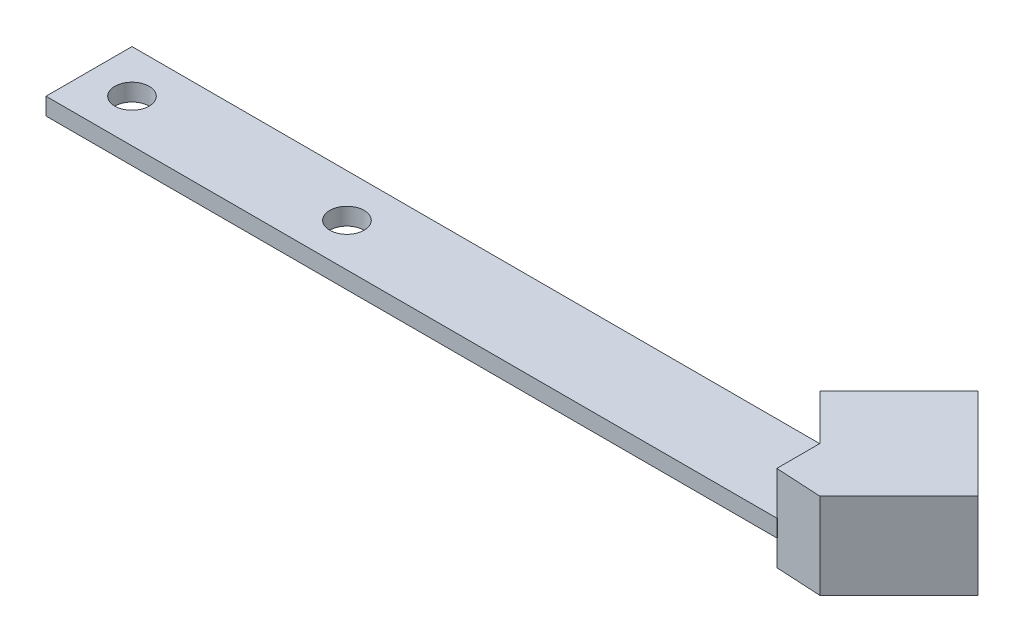
ISO-10303-21;
HEADER;
FILE_DESCRIPTION(('STEP AP214'),'2;1');
FILE_NAME('part.step','',(''),(''),'','','');
FILE_SCHEMA(('AUTOMOTIVE_DESIGN { 1 0 10303 214 1 1 1 1 }'));
ENDSEC;
DATA;
#1=APPLICATION_CONTEXT('core data for automotive mechanical design processes');
#2=APPLICATION_PROTOCOL_DEFINITION('international standard','automotive_design',2000,#1);
#3=PRODUCT_CONTEXT('',#1,'mechanical');
#4=PRODUCT('Part','Part','',(#3));
#5=PRODUCT_RELATED_PRODUCT_CATEGORY('part','',(#4));
#6=PRODUCT_DEFINITION_FORMATION('','',#4);
#7=PRODUCT_DEFINITION_CONTEXT('part definition',#1,'design');
#8=PRODUCT_DEFINITION('design','',#6,#7);
#9=PRODUCT_DEFINITION_SHAPE('','',#8);
#10=(LENGTH_UNIT() NAMED_UNIT(*) SI_UNIT(.MILLI.,.METRE.));
#11=(NAMED_UNIT(*) PLANE_ANGLE_UNIT() SI_UNIT($,.RADIAN.));
#12=(NAMED_UNIT(*) SI_UNIT($,.STERADIAN.) SOLID_ANGLE_UNIT());
#13=UNCERTAINTY_MEASURE_WITH_UNIT(LENGTH_MEASURE(1.E-05),#10,'distance_accuracy_value','');
#14=(GEOMETRIC_REPRESENTATION_CONTEXT(3) GLOBAL_UNCERTAINTY_ASSIGNED_CONTEXT((#13)) GLOBAL_UNIT_ASSIGNED_CONTEXT((#10,
#11,#12)) REPRESENTATION_CONTEXT('',''));
#15=CARTESIAN_POINT('',(0.,0.,0.));
#16=DIRECTION('',(0.,0.,1.));
#17=DIRECTION('',(1.,0.,0.));
#18=AXIS2_PLACEMENT_3D('',#15,#16,#17);
#19=CARTESIAN_POINT('',(0.,2.,0.));
#20=DIRECTION('',(0.,1.,0.));
#21=DIRECTION('',(0.,0.,1.));
#22=AXIS2_PLACEMENT_3D('',#19,#20,#21);
#23=PLANE('',#22);
#24=DIRECTION('',(0.998523413977836,0.,0.054323031377558));
#25=VECTOR('',#24,1.);
#26=CARTESIAN_POINT('',(0.0223121681594435,2.,-0.410124798982022));
#27=LINE('',#26,#25);
#28=CARTESIAN_POINT('',(60.7009699996036,2.,2.89099822646044));
#29=VERTEX_POINT('',#28);
#30=CARTESIAN_POINT('',(60.7708185534303,2.,2.89479822266292));
#31=VERTEX_POINT('',#30);
#32=EDGE_CURVE('E168',#29,#31,#27,.T.);
#33=ORIENTED_EDGE('',*,*,#32,.F.);
#34=DIRECTION('',(0.,0.,1.));
#35=VECTOR('',#34,1.);
#36=CARTESIAN_POINT('',(60.7009699996036,2.,0.));
#37=LINE('',#36,#35);
#38=CARTESIAN_POINT('',(60.7009699996036,2.,-2.12378523271647));
#39=VERTEX_POINT('',#38);
#40=EDGE_CURVE('E162',#39,#29,#37,.T.);
#41=ORIENTED_EDGE('',*,*,#40,.F.);
#42=DIRECTION('',(-0.707106781186549,0.,-0.707106781186546));
#43=VECTOR('',#42,1.);
#44=CARTESIAN_POINT('',(31.4123776161599,2.,-31.4123776161601));
#45=LINE('',#44,#43);
#46=CARTESIAN_POINT('',(55.7708185534303,2.,-7.05393667888983));
#47=VERTEX_POINT('',#46);
#48=EDGE_CURVE('E199',#39,#47,#45,.T.);
#49=ORIENTED_EDGE('',*,*,#48,.T.);
#50=DIRECTION('',(-1.,0.,0.));
#51=VECTOR('',#50,1.);
#52=CARTESIAN_POINT('',(-24.2291814465697,2.,-7.05393667888983));
#53=LINE('',#52,#51);
#54=CARTESIAN_POINT('',(-24.2291814465697,2.,-7.05393667888983));
#55=VERTEX_POINT('',#54);
#56=EDGE_CURVE('E224',#47,#55,#53,.T.);
#57=ORIENTED_EDGE('',*,*,#56,.T.);
#58=DIRECTION('',(0.,0.,1.));
#59=VECTOR('',#58,1.);
#60=CARTESIAN_POINT('',(-24.2291814465697,2.,-7.05393667888983));
#61=LINE('',#60,#59);
#62=CARTESIAN_POINT('',(-24.2291814465697,2.,2.94606332111017));
#63=VERTEX_POINT('',#62);
#64=EDGE_CURVE('E215',#55,#63,#61,.T.);
#65=ORIENTED_EDGE('',*,*,#64,.T.);
#66=DIRECTION('',(1.,0.,0.));
#67=VECTOR('',#66,1.);
#68=CARTESIAN_POINT('',(-24.2291814465697,2.,2.94606332111017));
#69=LINE('',#68,#67);
#70=CARTESIAN_POINT('',(60.7708185534303,2.,2.94606332111017));
#71=VERTEX_POINT('',#70);
#72=EDGE_CURVE('E218',#63,#71,#69,.T.);
#73=ORIENTED_EDGE('',*,*,#72,.T.);
#74=DIRECTION('',(0.,0.,-1.));
#75=VECTOR('',#74,1.);
#76=CARTESIAN_POINT('',(60.7708185534303,2.,-7.05393667888983));
#77=LINE('',#76,#75);
#78=EDGE_CURVE('E221',#71,#31,#77,.T.);
#79=ORIENTED_EDGE('',*,*,#78,.T.);
#80=EDGE_LOOP('',(#33,#41,#49,#57,#65,#73,#79));
#81=FACE_BOUND('',#80,.T.);
#82=CARTESIAN_POINT('',(-19.2291814465697,2.,-2.05393667888983));
#83=DIRECTION('',(0.,1.,0.));
#84=DIRECTION('',(0.,0.,1.));
#85=AXIS2_PLACEMENT_3D('',#82,#83,#84);
#86=CIRCLE('',#85,2.);
#87=CARTESIAN_POINT('',(-19.2291814465697,2.,-0.0539366788898303));
#88=VERTEX_POINT('',#87);
#89=EDGE_CURVE('E209',#88,#88,#86,.T.);
#90=ORIENTED_EDGE('',*,*,#89,.F.);
#91=EDGE_LOOP('',(#90));
#92=FACE_BOUND('',#91,.T.);
#93=CARTESIAN_POINT('',(5.77081855343026,2.,-2.05393667888983));
#94=DIRECTION('',(0.,1.,0.));
#95=DIRECTION('',(0.,0.,1.));
#96=AXIS2_PLACEMENT_3D('',#93,#94,#95);
#97=CIRCLE('',#96,2.);
#98=CARTESIAN_POINT('',(5.77081855343026,2.,-0.0539366788898329));
#99=VERTEX_POINT('',#98);
#100=EDGE_CURVE('E203',#99,#99,#97,.T.);
#101=ORIENTED_EDGE('',*,*,#100,.F.);
#102=EDGE_LOOP('',(#101));
#103=FACE_BOUND('',#102,.T.);
#104=ADVANCED_FACE('F33',(#81,#92,#103),#23,.T.);
#105=CARTESIAN_POINT('',(0.,0.,0.));
#106=DIRECTION('',(0.,1.,0.));
#107=DIRECTION('',(0.,0.,1.));
#108=AXIS2_PLACEMENT_3D('',#105,#106,#107);
#109=PLANE('',#108);
#110=CARTESIAN_POINT('',(5.77081855343026,0.,-2.05393667888983));
#111=DIRECTION('',(0.,1.,0.));
#112=DIRECTION('',(0.,0.,1.));
#113=AXIS2_PLACEMENT_3D('',#110,#111,#112);
#114=CIRCLE('',#113,2.);
#115=CARTESIAN_POINT('',(5.77081855343026,0.,-0.0539366788898329));
#116=VERTEX_POINT('',#115);
#117=EDGE_CURVE('E202',#116,#116,#114,.T.);
#118=ORIENTED_EDGE('',*,*,#117,.T.);
#119=EDGE_LOOP('',(#118));
#120=FACE_BOUND('',#119,.T.);
#121=CARTESIAN_POINT('',(-19.2291814465697,0.,-2.05393667888983));
#122=DIRECTION('',(0.,1.,0.));
#123=DIRECTION('',(0.,0.,1.));
#124=AXIS2_PLACEMENT_3D('',#121,#122,#123);
#125=CIRCLE('',#124,2.);
#126=CARTESIAN_POINT('',(-19.2291814465697,0.,-0.0539366788898303));
#127=VERTEX_POINT('',#126);
#128=EDGE_CURVE('E206',#127,#127,#125,.T.);
#129=ORIENTED_EDGE('',*,*,#128,.T.);
#130=EDGE_LOOP('',(#129));
#131=FACE_BOUND('',#130,.T.);
#132=DIRECTION('',(0.,0.,1.));
#133=VECTOR('',#132,1.);
#134=CARTESIAN_POINT('',(60.7009699996036,0.,0.));
#135=LINE('',#134,#133);
#136=CARTESIAN_POINT('',(60.7009699996036,0.,-2.12378523271647));
#137=VERTEX_POINT('',#136);
#138=CARTESIAN_POINT('',(60.7009699996036,0.,2.89099822646044));
#139=VERTEX_POINT('',#138);
#140=EDGE_CURVE('E138',#137,#139,#135,.T.);
#141=ORIENTED_EDGE('',*,*,#140,.T.);
#142=DIRECTION('',(0.998523413977836,0.,0.054323031377558));
#143=VECTOR('',#142,1.);
#144=CARTESIAN_POINT('',(0.0223121681594435,0.,-0.410124798982022));
#145=LINE('',#144,#143);
#146=CARTESIAN_POINT('',(60.7708185534303,0.,2.89479822266292));
#147=VERTEX_POINT('',#146);
#148=EDGE_CURVE('E135',#139,#147,#145,.T.);
#149=ORIENTED_EDGE('',*,*,#148,.T.);
#150=DIRECTION('',(0.,0.,-1.));
#151=VECTOR('',#150,1.);
#152=CARTESIAN_POINT('',(60.7708185534303,0.,-7.05393667888983));
#153=LINE('',#152,#151);
#154=CARTESIAN_POINT('',(60.7708185534303,0.,2.94606332111017));
#155=VERTEX_POINT('',#154);
#156=EDGE_CURVE('E231',#155,#147,#153,.T.);
#157=ORIENTED_EDGE('',*,*,#156,.F.);
#158=DIRECTION('',(1.,0.,0.));
#159=VECTOR('',#158,1.);
#160=CARTESIAN_POINT('',(-24.2291814465697,0.,2.94606332111017));
#161=LINE('',#160,#159);
#162=CARTESIAN_POINT('',(-24.2291814465697,0.,2.94606332111017));
#163=VERTEX_POINT('',#162);
#164=EDGE_CURVE('E229',#163,#155,#161,.T.);
#165=ORIENTED_EDGE('',*,*,#164,.F.);
#166=DIRECTION('',(0.,0.,1.));
#167=VECTOR('',#166,1.);
#168=CARTESIAN_POINT('',(-24.2291814465697,0.,-7.05393667888983));
#169=LINE('',#168,#167);
#170=CARTESIAN_POINT('',(-24.2291814465697,0.,-7.05393667888983));
#171=VERTEX_POINT('',#170);
#172=EDGE_CURVE('E212',#171,#163,#169,.T.);
#173=ORIENTED_EDGE('',*,*,#172,.F.);
#174=DIRECTION('',(-1.,0.,0.));
#175=VECTOR('',#174,1.);
#176=CARTESIAN_POINT('',(-24.2291814465697,0.,-7.05393667888983));
#177=LINE('',#176,#175);
#178=CARTESIAN_POINT('',(55.7708185534302,0.,-7.05393667888983));
#179=VERTEX_POINT('',#178);
#180=EDGE_CURVE('E219',#179,#171,#177,.T.);
#181=ORIENTED_EDGE('',*,*,#180,.F.);
#182=DIRECTION('',(-0.707106781186549,0.,-0.707106781186546));
#183=VECTOR('',#182,1.);
#184=CARTESIAN_POINT('',(31.4123776161599,0.,-31.4123776161601));
#185=LINE('',#184,#183);
#186=EDGE_CURVE('E55',#137,#179,#185,.T.);
#187=ORIENTED_EDGE('',*,*,#186,.F.);
#188=EDGE_LOOP('',(#141,#149,#157,#165,#173,#181,#187));
#189=FACE_BOUND('',#188,.T.);
#190=ADVANCED_FACE('F250',(#120,#131,#189),#109,.F.);
#191=CARTESIAN_POINT('',(60.7708185534303,2.,-7.05393667888983));
#192=DIRECTION('',(-1.,0.,0.));
#193=DIRECTION('',(0.,0.,1.));
#194=AXIS2_PLACEMENT_3D('',#191,#192,#193);
#195=PLANE('',#194);
#196=ORIENTED_EDGE('',*,*,#156,.T.);
#197=DIRECTION('',(0.,1.,0.));
#198=VECTOR('',#197,1.);
#199=CARTESIAN_POINT('',(60.7708185534303,2.,2.89479822266292));
#200=LINE('',#199,#198);
#201=EDGE_CURVE('E164',#147,#31,#200,.T.);
#202=ORIENTED_EDGE('',*,*,#201,.T.);
#203=ORIENTED_EDGE('',*,*,#78,.F.);
#204=DIRECTION('',(0.,-1.,0.));
#205=VECTOR('',#204,1.);
#206=CARTESIAN_POINT('',(60.7708185534303,2.,2.94606332111017));
#207=LINE('',#206,#205);
#208=EDGE_CURVE('E237',#71,#155,#207,.T.);
#209=ORIENTED_EDGE('',*,*,#208,.T.);
#210=EDGE_LOOP('',(#196,#202,#203,#209));
#211=FACE_BOUND('',#210,.T.);
#212=ADVANCED_FACE('F253',(#211),#195,.F.);
#213=CARTESIAN_POINT('',(-24.2291814465697,2.,-7.05393667888983));
#214=DIRECTION('',(0.,0.,1.));
#215=DIRECTION('',(1.,0.,0.));
#216=AXIS2_PLACEMENT_3D('',#213,#214,#215);
#217=PLANE('',#216);
#218=DIRECTION('',(0.,1.,0.));
#219=VECTOR('',#218,1.);
#220=CARTESIAN_POINT('',(55.7708185534302,2.,-7.05393667888983));
#221=LINE('',#220,#219);
#222=EDGE_CURVE('E11',#179,#47,#221,.T.);
#223=ORIENTED_EDGE('',*,*,#222,.F.);
#224=ORIENTED_EDGE('',*,*,#180,.T.);
#225=DIRECTION('',(0.,-1.,0.));
#226=VECTOR('',#225,1.);
#227=CARTESIAN_POINT('',(-24.2291814465697,2.,-7.05393667888983));
#228=LINE('',#227,#226);
#229=EDGE_CURVE('E226',#55,#171,#228,.T.);
#230=ORIENTED_EDGE('',*,*,#229,.F.);
#231=ORIENTED_EDGE('',*,*,#56,.F.);
#232=EDGE_LOOP('',(#223,#224,#230,#231));
#233=FACE_BOUND('',#232,.T.);
#234=ADVANCED_FACE('F262',(#233),#217,.F.);
#235=CARTESIAN_POINT('',(-24.2291814465697,2.,-7.05393667888983));
#236=DIRECTION('',(1.,0.,0.));
#237=DIRECTION('',(0.,0.,-1.));
#238=AXIS2_PLACEMENT_3D('',#235,#236,#237);
#239=PLANE('',#238);
#240=ORIENTED_EDGE('',*,*,#172,.T.);
#241=DIRECTION('',(0.,-1.,0.));
#242=VECTOR('',#241,1.);
#243=CARTESIAN_POINT('',(-24.2291814465697,2.,2.94606332111017));
#244=LINE('',#243,#242);
#245=EDGE_CURVE('E41',#63,#163,#244,.T.);
#246=ORIENTED_EDGE('',*,*,#245,.F.);
#247=ORIENTED_EDGE('',*,*,#64,.F.);
#248=ORIENTED_EDGE('',*,*,#229,.T.);
#249=EDGE_LOOP('',(#240,#246,#247,#248));
#250=FACE_BOUND('',#249,.T.);
#251=ADVANCED_FACE('F35',(#250),#239,.F.);
#252=CARTESIAN_POINT('',(-24.2291814465697,2.,2.94606332111017));
#253=DIRECTION('',(0.,0.,-1.));
#254=DIRECTION('',(-1.,0.,0.));
#255=AXIS2_PLACEMENT_3D('',#252,#253,#254);
#256=PLANE('',#255);
#257=ORIENTED_EDGE('',*,*,#164,.T.);
#258=ORIENTED_EDGE('',*,*,#208,.F.);
#259=ORIENTED_EDGE('',*,*,#72,.F.);
#260=ORIENTED_EDGE('',*,*,#245,.T.);
#261=EDGE_LOOP('',(#257,#258,#259,#260));
#262=FACE_BOUND('',#261,.T.);
#263=ADVANCED_FACE('F242',(#262),#256,.F.);
#264=CARTESIAN_POINT('',(-19.2291814465697,2.,-2.05393667888983));
#265=DIRECTION('',(0.,-1.,0.));
#266=DIRECTION('',(0.,0.,-1.));
#267=AXIS2_PLACEMENT_3D('',#264,#265,#266);
#268=CYLINDRICAL_SURFACE('',#267,2.);
#269=ORIENTED_EDGE('',*,*,#89,.T.);
#270=EDGE_LOOP('',(#269));
#271=FACE_BOUND('',#270,.T.);
#272=ORIENTED_EDGE('',*,*,#128,.F.);
#273=EDGE_LOOP('',(#272));
#274=FACE_BOUND('',#273,.T.);
#275=ADVANCED_FACE('F297',(#271,#274),#268,.F.);
#276=CARTESIAN_POINT('',(5.77081855343026,2.,-2.05393667888983));
#277=DIRECTION('',(0.,-1.,0.));
#278=DIRECTION('',(0.,0.,-1.));
#279=AXIS2_PLACEMENT_3D('',#276,#277,#278);
#280=CYLINDRICAL_SURFACE('',#279,2.);
#281=ORIENTED_EDGE('',*,*,#100,.T.);
#282=EDGE_LOOP('',(#281));
#283=FACE_BOUND('',#282,.T.);
#284=ORIENTED_EDGE('',*,*,#117,.F.);
#285=EDGE_LOOP('',(#284));
#286=FACE_BOUND('',#285,.T.);
#287=ADVANCED_FACE('F308',(#283,#286),#280,.F.);
#288=CARTESIAN_POINT('',(31.41237761616,0.,-31.4123776161601));
#289=DIRECTION('',(-0.707106781186546,0.,0.707106781186549));
#290=DIRECTION('',(0.707106781186549,0.,0.707106781186546));
#291=AXIS2_PLACEMENT_3D('',#288,#289,#290);
#292=PLANE('',#291);
#293=DIRECTION('',(0.,1.,0.));
#294=VECTOR('',#293,1.);
#295=CARTESIAN_POINT('',(60.7009699996036,-3.04738705511553,-2.12378523271647));
#296=LINE('',#295,#294);
#297=CARTESIAN_POINT('',(60.7009699996036,6.95261294488447,-2.12378523271647));
#298=VERTEX_POINT('',#297);
#299=EDGE_CURVE('E151',#39,#298,#296,.T.);
#300=ORIENTED_EDGE('',*,*,#299,.T.);
#301=DIRECTION('',(0.707106781186549,0.,0.707106781186546));
#302=VECTOR('',#301,1.);
#303=CARTESIAN_POINT('',(55.3976691407045,6.95261294488447,-7.42708609161557));
#304=LINE('',#303,#302);
#305=CARTESIAN_POINT('',(55.3976691407045,6.95261294488447,-7.42708609161557));
#306=VERTEX_POINT('',#305);
#307=EDGE_CURVE('E184',#306,#298,#304,.T.);
#308=ORIENTED_EDGE('',*,*,#307,.F.);
#309=DIRECTION('',(0.,1.,0.));
#310=VECTOR('',#309,1.);
#311=CARTESIAN_POINT('',(55.3976691407045,6.95261294488447,-7.42708609161557));
#312=LINE('',#311,#310);
#313=CARTESIAN_POINT('',(55.3976691407045,-3.04738705511553,-7.42708609161557));
#314=VERTEX_POINT('',#313);
#315=EDGE_CURVE('E170',#314,#306,#312,.T.);
#316=ORIENTED_EDGE('',*,*,#315,.F.);
#317=DIRECTION('',(-0.707106781186549,0.,-0.707106781186546));
#318=VECTOR('',#317,1.);
#319=CARTESIAN_POINT('',(55.3976691407045,-3.04738705511553,-7.42708609161557));
#320=LINE('',#319,#318);
#321=CARTESIAN_POINT('',(60.7009699996036,-3.04738705511553,-2.12378523271647));
#322=VERTEX_POINT('',#321);
#323=EDGE_CURVE('E175',#322,#314,#320,.T.);
#324=ORIENTED_EDGE('',*,*,#323,.F.);
#325=EDGE_CURVE('E142',#322,#137,#296,.T.);
#326=ORIENTED_EDGE('',*,*,#325,.T.);
#327=ORIENTED_EDGE('',*,*,#186,.T.);
#328=ORIENTED_EDGE('',*,*,#222,.T.);
#329=ORIENTED_EDGE('',*,*,#48,.F.);
#330=EDGE_LOOP('',(#300,#308,#316,#324,#326,#327,#328,#329));
#331=FACE_BOUND('',#330,.T.);
#332=ADVANCED_FACE('F263',(#331),#292,.T.);
#333=CARTESIAN_POINT('',(64.5900572961296,6.95261294488447,-16.6194742470407));
#334=DIRECTION('',(0.707106781186549,0.,0.707106781186546));
#335=DIRECTION('',(0.707106781186546,0.,-0.707106781186549));
#336=AXIS2_PLACEMENT_3D('',#333,#334,#335);
#337=PLANE('',#336);
#338=ORIENTED_EDGE('',*,*,#315,.T.);
#339=DIRECTION('',(-0.707106781186546,0.,0.707106781186549));
#340=VECTOR('',#339,1.);
#341=CARTESIAN_POINT('',(64.5900572961296,6.95261294488447,-16.6194742470407));
#342=LINE('',#341,#340);
#343=CARTESIAN_POINT('',(64.5900572961296,6.95261294488447,-16.6194742470407));
#344=VERTEX_POINT('',#343);
#345=EDGE_CURVE('E196',#344,#306,#342,.T.);
#346=ORIENTED_EDGE('',*,*,#345,.F.);
#347=DIRECTION('',(0.,1.,0.));
#348=VECTOR('',#347,1.);
#349=CARTESIAN_POINT('',(64.5900572961296,6.95261294488447,-16.6194742470407));
#350=LINE('',#349,#348);
#351=CARTESIAN_POINT('',(64.5900572961296,-3.04738705511553,-16.6194742470407));
#352=VERTEX_POINT('',#351);
#353=EDGE_CURVE('E171',#352,#344,#350,.T.);
#354=ORIENTED_EDGE('',*,*,#353,.F.);
#355=DIRECTION('',(-0.707106781186546,0.,0.707106781186549));
#356=VECTOR('',#355,1.);
#357=CARTESIAN_POINT('',(64.5900572961296,-3.04738705511553,-16.6194742470407));
#358=LINE('',#357,#356);
#359=EDGE_CURVE('E181',#352,#314,#358,.T.);
#360=ORIENTED_EDGE('',*,*,#359,.T.);
#361=EDGE_LOOP('',(#338,#346,#354,#360));
#362=FACE_BOUND('',#361,.T.);
#363=ADVANCED_FACE('F273',(#362),#337,.F.);
#364=CARTESIAN_POINT('',(64.5900572961296,6.95261294488447,-16.6194742470407));
#365=DIRECTION('',(0.,-1.,0.));
#366=DIRECTION('',(0.,0.,-1.));
#367=AXIS2_PLACEMENT_3D('',#364,#365,#366);
#368=PLANE('',#367);
#369=ORIENTED_EDGE('',*,*,#307,.T.);
#370=DIRECTION('',(0.,0.,1.));
#371=VECTOR('',#370,1.);
#372=CARTESIAN_POINT('',(60.7009699996036,6.95261294488447,-2.12378523271647));
#373=LINE('',#372,#371);
#374=CARTESIAN_POINT('',(60.7009699996036,6.95261294488447,2.89099822646044));
#375=VERTEX_POINT('',#374);
#376=EDGE_CURVE('E156',#298,#375,#373,.T.);
#377=ORIENTED_EDGE('',*,*,#376,.T.);
#378=DIRECTION('',(0.998523413977836,0.,0.054323031377558));
#379=VECTOR('',#378,1.);
#380=CARTESIAN_POINT('',(60.7009699996036,6.95261294488447,2.89099822646044));
#381=LINE('',#380,#379);
#382=CARTESIAN_POINT('',(66.0042708585027,6.95261294488447,3.17951562618263));
#383=VERTEX_POINT('',#382);
#384=EDGE_CURVE('E144',#375,#383,#381,.T.);
#385=ORIENTED_EDGE('',*,*,#384,.T.);
#386=DIRECTION('',(-0.707106781186546,0.,0.707106781186549));
#387=VECTOR('',#386,1.);
#388=CARTESIAN_POINT('',(75.1966590139278,6.95261294488447,-6.01287252924251));
#389=LINE('',#388,#387);
#390=CARTESIAN_POINT('',(75.1966590139278,6.95261294488447,-6.01287252924251));
#391=VERTEX_POINT('',#390);
#392=EDGE_CURVE('E193',#391,#383,#389,.T.);
#393=ORIENTED_EDGE('',*,*,#392,.F.);
#394=DIRECTION('',(0.707106781186549,0.,0.707106781186546));
#395=VECTOR('',#394,1.);
#396=CARTESIAN_POINT('',(64.5900572961296,6.95261294488447,-16.6194742470407));
#397=LINE('',#396,#395);
#398=EDGE_CURVE('E174',#344,#391,#397,.T.);
#399=ORIENTED_EDGE('',*,*,#398,.F.);
#400=ORIENTED_EDGE('',*,*,#345,.T.);
#401=EDGE_LOOP('',(#369,#377,#385,#393,#399,#400));
#402=FACE_BOUND('',#401,.T.);
#403=ADVANCED_FACE('F267',(#402),#368,.F.);
#404=CARTESIAN_POINT('',(75.1966590139278,6.95261294488447,-6.01287252924251));
#405=DIRECTION('',(-0.707106781186549,0.,-0.707106781186546));
#406=DIRECTION('',(-0.707106781186546,0.,0.707106781186549));
#407=AXIS2_PLACEMENT_3D('',#404,#405,#406);
#408=PLANE('',#407);
#409=DIRECTION('',(0.,-1.,0.));
#410=VECTOR('',#409,1.);
#411=CARTESIAN_POINT('',(66.0042708585027,6.95261294488447,3.17951562618263));
#412=LINE('',#411,#410);
#413=CARTESIAN_POINT('',(66.0042708585027,-3.04738705511553,3.17951562618263));
#414=VERTEX_POINT('',#413);
#415=EDGE_CURVE('E187',#383,#414,#412,.T.);
#416=ORIENTED_EDGE('',*,*,#415,.T.);
#417=DIRECTION('',(-0.707106781186546,0.,0.707106781186549));
#418=VECTOR('',#417,1.);
#419=CARTESIAN_POINT('',(75.1966590139278,-3.04738705511554,-6.01287252924251));
#420=LINE('',#419,#418);
#421=CARTESIAN_POINT('',(75.1966590139278,-3.04738705511554,-6.01287252924251));
#422=VERTEX_POINT('',#421);
#423=EDGE_CURVE('E150',#422,#414,#420,.T.);
#424=ORIENTED_EDGE('',*,*,#423,.F.);
#425=DIRECTION('',(0.,-1.,0.));
#426=VECTOR('',#425,1.);
#427=CARTESIAN_POINT('',(75.1966590139278,6.95261294488447,-6.01287252924251));
#428=LINE('',#427,#426);
#429=EDGE_CURVE('E177',#391,#422,#428,.T.);
#430=ORIENTED_EDGE('',*,*,#429,.F.);
#431=ORIENTED_EDGE('',*,*,#392,.T.);
#432=EDGE_LOOP('',(#416,#424,#430,#431));
#433=FACE_BOUND('',#432,.T.);
#434=ADVANCED_FACE('F279',(#433),#408,.F.);
#435=CARTESIAN_POINT('',(64.5900572961296,-3.04738705511553,-16.6194742470407));
#436=DIRECTION('',(0.,1.,0.));
#437=DIRECTION('',(-1.,0.,0.));
#438=AXIS2_PLACEMENT_3D('',#435,#436,#437);
#439=PLANE('',#438);
#440=ORIENTED_EDGE('',*,*,#423,.T.);
#441=DIRECTION('',(0.998523413977836,0.,0.054323031377558));
#442=VECTOR('',#441,1.);
#443=CARTESIAN_POINT('',(60.7009699996036,-3.04738705511553,2.89099822646044));
#444=LINE('',#443,#442);
#445=CARTESIAN_POINT('',(60.7009699996036,-3.04738705511553,2.89099822646044));
#446=VERTEX_POINT('',#445);
#447=EDGE_CURVE('E132',#446,#414,#444,.T.);
#448=ORIENTED_EDGE('',*,*,#447,.F.);
#449=DIRECTION('',(0.,0.,1.));
#450=VECTOR('',#449,1.);
#451=CARTESIAN_POINT('',(60.7009699996036,-3.04738705511553,-2.12378523271647));
#452=LINE('',#451,#450);
#453=EDGE_CURVE('E48',#322,#446,#452,.T.);
#454=ORIENTED_EDGE('',*,*,#453,.F.);
#455=ORIENTED_EDGE('',*,*,#323,.T.);
#456=ORIENTED_EDGE('',*,*,#359,.F.);
#457=DIRECTION('',(-0.707106781186549,0.,-0.707106781186546));
#458=VECTOR('',#457,1.);
#459=CARTESIAN_POINT('',(64.5900572961296,-3.04738705511553,-16.6194742470407));
#460=LINE('',#459,#458);
#461=EDGE_CURVE('E179',#422,#352,#460,.T.);
#462=ORIENTED_EDGE('',*,*,#461,.F.);
#463=EDGE_LOOP('',(#440,#448,#454,#455,#456,#462));
#464=FACE_BOUND('',#463,.T.);
#465=ADVANCED_FACE('F147',(#464),#439,.F.);
#466=CARTESIAN_POINT('',(40.6047657715851,0.,-40.6047657715852));
#467=DIRECTION('',(-0.707106781186546,0.,0.707106781186549));
#468=DIRECTION('',(0.707106781186549,0.,0.707106781186546));
#469=AXIS2_PLACEMENT_3D('',#466,#467,#468);
#470=PLANE('',#469);
#471=ORIENTED_EDGE('',*,*,#353,.T.);
#472=ORIENTED_EDGE('',*,*,#398,.T.);
#473=ORIENTED_EDGE('',*,*,#429,.T.);
#474=ORIENTED_EDGE('',*,*,#461,.T.);
#475=EDGE_LOOP('',(#471,#472,#473,#474));
#476=FACE_BOUND('',#475,.T.);
#477=ADVANCED_FACE('F276',(#476),#470,.F.);
#478=CARTESIAN_POINT('',(60.7009699996036,-3.04738705511553,-2.12378523271647));
#479=DIRECTION('',(-1.,0.,0.));
#480=DIRECTION('',(0.,0.,1.));
#481=AXIS2_PLACEMENT_3D('',#478,#479,#480);
#482=PLANE('',#481);
#483=ORIENTED_EDGE('',*,*,#140,.F.);
#484=ORIENTED_EDGE('',*,*,#325,.F.);
#485=ORIENTED_EDGE('',*,*,#453,.T.);
#486=DIRECTION('',(0.,1.,0.));
#487=VECTOR('',#486,1.);
#488=CARTESIAN_POINT('',(60.7009699996036,-3.04738705511553,2.89099822646044));
#489=LINE('',#488,#487);
#490=EDGE_CURVE('E129',#446,#139,#489,.T.);
#491=ORIENTED_EDGE('',*,*,#490,.T.);
#492=EDGE_LOOP('',(#483,#484,#485,#491));
#493=FACE_BOUND('',#492,.T.);
#494=ADVANCED_FACE('F141',(#493),#482,.T.);
#495=CARTESIAN_POINT('',(60.7009699996036,-3.04738705511553,2.89099822646044));
#496=DIRECTION('',(-0.054323031377558,0.,0.998523413977836));
#497=DIRECTION('',(0.998523413977836,0.,0.054323031377558));
#498=AXIS2_PLACEMENT_3D('',#495,#496,#497);
#499=PLANE('',#498);
#500=EDGE_CURVE('E139',#29,#375,#489,.T.);
#501=ORIENTED_EDGE('',*,*,#500,.F.);
#502=ORIENTED_EDGE('',*,*,#32,.T.);
#503=ORIENTED_EDGE('',*,*,#201,.F.);
#504=ORIENTED_EDGE('',*,*,#148,.F.);
#505=ORIENTED_EDGE('',*,*,#490,.F.);
#506=ORIENTED_EDGE('',*,*,#447,.T.);
#507=ORIENTED_EDGE('',*,*,#415,.F.);
#508=ORIENTED_EDGE('',*,*,#384,.F.);
#509=EDGE_LOOP('',(#501,#502,#503,#504,#505,#506,#507,#508));
#510=FACE_BOUND('',#509,.T.);
#511=ADVANCED_FACE('F131',(#510),#499,.T.);
#512=ORIENTED_EDGE('',*,*,#299,.F.);
#513=ORIENTED_EDGE('',*,*,#40,.T.);
#514=ORIENTED_EDGE('',*,*,#500,.T.);
#515=ORIENTED_EDGE('',*,*,#376,.F.);
#516=EDGE_LOOP('',(#512,#513,#514,#515));
#517=FACE_BOUND('',#516,.T.);
#518=ADVANCED_FACE('F280',(#517),#482,.T.);
#519=CLOSED_SHELL('',(#104,#190,#212,#234,#251,#263,#275,#287,#332,#363,#403,#434,#465,#477,
#494,#511,#518));
#520=MANIFOLD_SOLID_BREP('B2',#519);
#521=ADVANCED_BREP_SHAPE_REPRESENTATION('',(#18,#520),#14);
#522=SHAPE_DEFINITION_REPRESENTATION(#9,#521);
ENDSEC;
END-ISO-10303-21;
